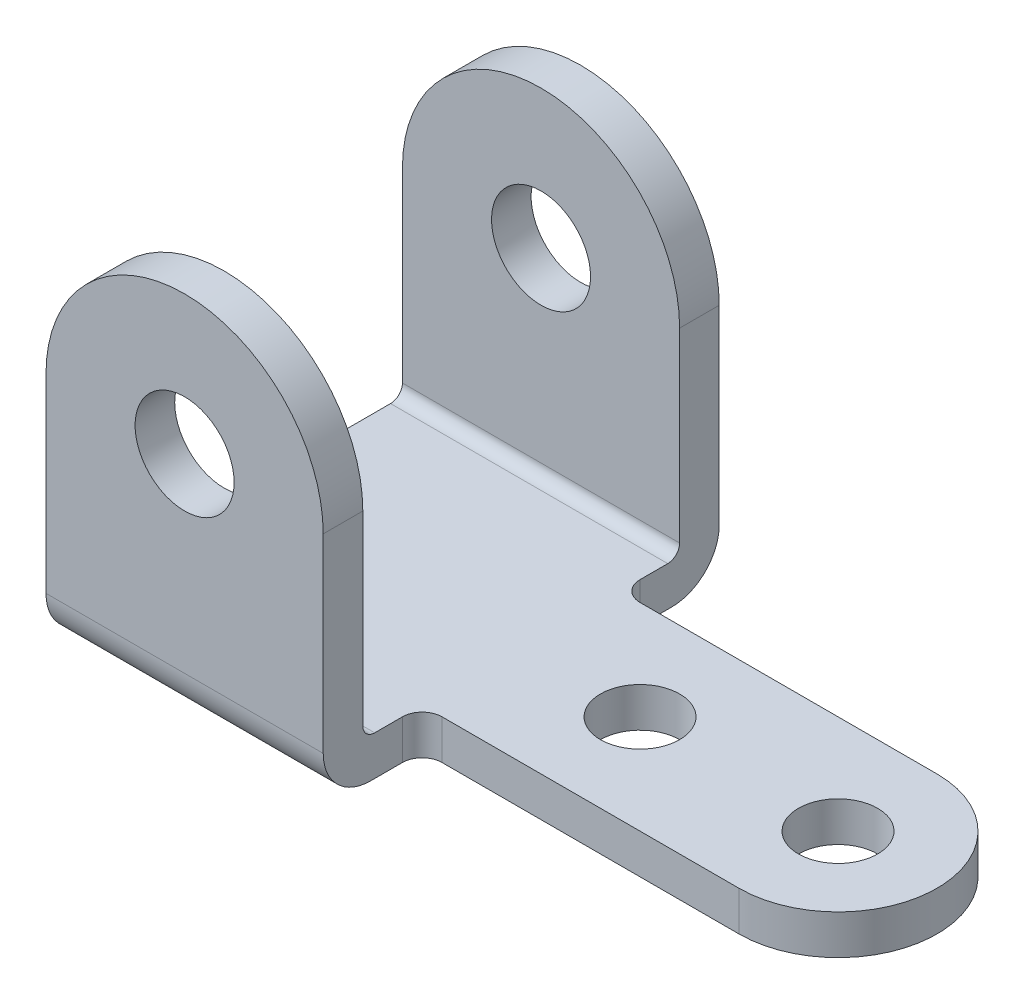
ISO-10303-21;
HEADER;
FILE_DESCRIPTION(('STEP AP214'),'2;1');
FILE_NAME('part.step','',(''),(''),'','','');
FILE_SCHEMA(('AUTOMOTIVE_DESIGN { 1 0 10303 214 1 1 1 1 }'));
ENDSEC;
DATA;
#1=APPLICATION_CONTEXT('core data for automotive mechanical design processes');
#2=APPLICATION_PROTOCOL_DEFINITION('international standard','automotive_design',2000,#1);
#3=PRODUCT_CONTEXT('',#1,'mechanical');
#4=PRODUCT('Part','Part','',(#3));
#5=PRODUCT_RELATED_PRODUCT_CATEGORY('part','',(#4));
#6=PRODUCT_DEFINITION_FORMATION('','',#4);
#7=PRODUCT_DEFINITION_CONTEXT('part definition',#1,'design');
#8=PRODUCT_DEFINITION('design','',#6,#7);
#9=PRODUCT_DEFINITION_SHAPE('','',#8);
#10=(LENGTH_UNIT() NAMED_UNIT(*) SI_UNIT(.MILLI.,.METRE.));
#11=(NAMED_UNIT(*) PLANE_ANGLE_UNIT() SI_UNIT($,.RADIAN.));
#12=(NAMED_UNIT(*) SI_UNIT($,.STERADIAN.) SOLID_ANGLE_UNIT());
#13=UNCERTAINTY_MEASURE_WITH_UNIT(LENGTH_MEASURE(1.E-05),#10,'distance_accuracy_value','');
#14=(GEOMETRIC_REPRESENTATION_CONTEXT(3) GLOBAL_UNCERTAINTY_ASSIGNED_CONTEXT((#13)) GLOBAL_UNIT_ASSIGNED_CONTEXT((#10,
#11,#12)) REPRESENTATION_CONTEXT('',''));
#15=CARTESIAN_POINT('',(0.,0.,0.));
#16=DIRECTION('',(0.,0.,1.));
#17=DIRECTION('',(1.,0.,0.));
#18=AXIS2_PLACEMENT_3D('',#15,#16,#17);
#19=CARTESIAN_POINT('',(70.,60.,10.));
#20=DIRECTION('',(1.,0.,0.));
#21=DIRECTION('',(0.,1.,0.));
#22=AXIS2_PLACEMENT_3D('',#19,#20,#21);
#23=PLANE('',#22);
#24=DIRECTION('',(0.,0.,-1.));
#25=VECTOR('',#24,1.);
#26=CARTESIAN_POINT('',(70.,0.,10.));
#27=LINE('',#26,#25);
#28=CARTESIAN_POINT('',(70.,0.,20.));
#29=VERTEX_POINT('',#28);
#30=CARTESIAN_POINT('',(70.,0.,12.));
#31=VERTEX_POINT('',#30);
#32=EDGE_CURVE('E246',#29,#31,#27,.T.);
#33=ORIENTED_EDGE('',*,*,#32,.T.);
#34=CARTESIAN_POINT('',(70.,12.,12.));
#35=DIRECTION('',(1.,0.,0.));
#36=DIRECTION('',(0.,1.,0.));
#37=AXIS2_PLACEMENT_3D('',#34,#35,#36);
#38=CIRCLE('',#37,12.);
#39=CARTESIAN_POINT('',(70.,12.,0.));
#40=VERTEX_POINT('',#39);
#41=EDGE_CURVE('E295',#31,#40,#38,.T.);
#42=ORIENTED_EDGE('',*,*,#41,.T.);
#43=DIRECTION('',(0.,-1.,0.));
#44=VECTOR('',#43,1.);
#45=CARTESIAN_POINT('',(70.,60.,0.));
#46=LINE('',#45,#44);
#47=CARTESIAN_POINT('',(70.,60.,0.));
#48=VERTEX_POINT('',#47);
#49=EDGE_CURVE('E236',#48,#40,#46,.T.);
#50=ORIENTED_EDGE('',*,*,#49,.F.);
#51=DIRECTION('',(0.,0.,-1.));
#52=VECTOR('',#51,1.);
#53=CARTESIAN_POINT('',(70.,60.,10.));
#54=LINE('',#53,#52);
#55=CARTESIAN_POINT('',(70.,60.,10.));
#56=VERTEX_POINT('',#55);
#57=EDGE_CURVE('E253',#56,#48,#54,.T.);
#58=ORIENTED_EDGE('',*,*,#57,.F.);
#59=DIRECTION('',(0.,-1.,0.));
#60=VECTOR('',#59,1.);
#61=CARTESIAN_POINT('',(70.,60.,10.));
#62=LINE('',#61,#60);
#63=CARTESIAN_POINT('',(70.,13.,10.));
#64=VERTEX_POINT('',#63);
#65=EDGE_CURVE('E237',#56,#64,#62,.T.);
#66=ORIENTED_EDGE('',*,*,#65,.T.);
#67=CARTESIAN_POINT('',(70.,13.,13.));
#68=DIRECTION('',(1.,0.,0.));
#69=DIRECTION('',(0.,1.,0.));
#70=AXIS2_PLACEMENT_3D('',#67,#68,#69);
#71=CIRCLE('',#70,3.);
#72=CARTESIAN_POINT('',(70.,10.,13.));
#73=VERTEX_POINT('',#72);
#74=EDGE_CURVE('E304',#64,#73,#71,.F.);
#75=ORIENTED_EDGE('',*,*,#74,.T.);
#76=DIRECTION('',(0.,0.,-1.));
#77=VECTOR('',#76,1.);
#78=CARTESIAN_POINT('',(70.,10.,90.));
#79=LINE('',#78,#77);
#80=CARTESIAN_POINT('',(70.,10.,20.));
#81=VERTEX_POINT('',#80);
#82=EDGE_CURVE('E233',#81,#73,#79,.T.);
#83=ORIENTED_EDGE('',*,*,#82,.F.);
#84=DIRECTION('',(0.,1.,0.));
#85=VECTOR('',#84,1.);
#86=CARTESIAN_POINT('',(70.,0.,20.));
#87=LINE('',#86,#85);
#88=EDGE_CURVE('E265',#81,#29,#87,.F.);
#89=ORIENTED_EDGE('',*,*,#88,.T.);
#90=EDGE_LOOP('',(#33,#42,#50,#58,#66,#75,#83,#89));
#91=FACE_BOUND('',#90,.T.);
#92=ADVANCED_FACE('F37',(#91),#23,.T.);
#93=CARTESIAN_POINT('',(35.,60.,10.));
#94=DIRECTION('',(0.,0.,-1.));
#95=DIRECTION('',(-1.,0.,0.));
#96=AXIS2_PLACEMENT_3D('',#93,#94,#95);
#97=PLANE('',#96);
#98=CARTESIAN_POINT('',(35.,60.,10.));
#99=DIRECTION('',(0.,0.,-1.));
#100=DIRECTION('',(-1.,0.,0.));
#101=AXIS2_PLACEMENT_3D('',#98,#99,#100);
#102=CIRCLE('',#101,12.5);
#103=CARTESIAN_POINT('',(22.5,60.,10.));
#104=VERTEX_POINT('',#103);
#105=EDGE_CURVE('E208',#104,#104,#102,.T.);
#106=ORIENTED_EDGE('',*,*,#105,.T.);
#107=EDGE_LOOP('',(#106));
#108=FACE_BOUND('',#107,.T.);
#109=DIRECTION('',(0.,1.,0.));
#110=VECTOR('',#109,1.);
#111=CARTESIAN_POINT('',(0.,0.,10.));
#112=LINE('',#111,#110);
#113=CARTESIAN_POINT('',(0.,13.,10.));
#114=VERTEX_POINT('',#113);
#115=CARTESIAN_POINT('',(0.,60.,10.));
#116=VERTEX_POINT('',#115);
#117=EDGE_CURVE('E240',#114,#116,#112,.T.);
#118=ORIENTED_EDGE('',*,*,#117,.F.);
#119=DIRECTION('',(-1.,0.,0.));
#120=VECTOR('',#119,1.);
#121=CARTESIAN_POINT('',(35.,13.,10.));
#122=LINE('',#121,#120);
#123=EDGE_CURVE('E300',#114,#64,#122,.F.);
#124=ORIENTED_EDGE('',*,*,#123,.T.);
#125=ORIENTED_EDGE('',*,*,#65,.F.);
#126=CARTESIAN_POINT('',(35.,60.,10.));
#127=DIRECTION('',(0.,0.,-1.));
#128=DIRECTION('',(-1.,0.,0.));
#129=AXIS2_PLACEMENT_3D('',#126,#127,#128);
#130=CIRCLE('',#129,35.);
#131=EDGE_CURVE('E243',#116,#56,#130,.T.);
#132=ORIENTED_EDGE('',*,*,#131,.F.);
#133=EDGE_LOOP('',(#118,#124,#125,#132));
#134=FACE_BOUND('',#133,.T.);
#135=ADVANCED_FACE('F351',(#108,#134),#97,.F.);
#136=DIRECTION('',(0.,1.,0.));
#137=VECTOR('',#136,1.);
#138=CARTESIAN_POINT('',(70.,60.,100.));
#139=LINE('',#138,#137);
#140=CARTESIAN_POINT('',(70.,12.,100.));
#141=VERTEX_POINT('',#140);
#142=CARTESIAN_POINT('',(70.,60.,100.));
#143=VERTEX_POINT('',#142);
#144=EDGE_CURVE('E212',#141,#143,#139,.T.);
#145=ORIENTED_EDGE('',*,*,#144,.F.);
#146=CARTESIAN_POINT('',(70.,12.,88.));
#147=DIRECTION('',(1.,0.,0.));
#148=DIRECTION('',(0.,1.,0.));
#149=AXIS2_PLACEMENT_3D('',#146,#147,#148);
#150=CIRCLE('',#149,12.);
#151=CARTESIAN_POINT('',(70.,0.,88.));
#152=VERTEX_POINT('',#151);
#153=EDGE_CURVE('E282',#141,#152,#150,.T.);
#154=ORIENTED_EDGE('',*,*,#153,.T.);
#155=CARTESIAN_POINT('',(70.,0.,80.));
#156=VERTEX_POINT('',#155);
#157=EDGE_CURVE('E261',#152,#156,#27,.T.);
#158=ORIENTED_EDGE('',*,*,#157,.T.);
#159=DIRECTION('',(0.,1.,0.));
#160=VECTOR('',#159,1.);
#161=CARTESIAN_POINT('',(70.,10.,80.));
#162=LINE('',#161,#160);
#163=CARTESIAN_POINT('',(70.,10.,80.));
#164=VERTEX_POINT('',#163);
#165=EDGE_CURVE('E267',#156,#164,#162,.T.);
#166=ORIENTED_EDGE('',*,*,#165,.T.);
#167=CARTESIAN_POINT('',(70.,10.,87.));
#168=VERTEX_POINT('',#167);
#169=EDGE_CURVE('E234',#168,#164,#79,.T.);
#170=ORIENTED_EDGE('',*,*,#169,.F.);
#171=CARTESIAN_POINT('',(70.,13.,87.));
#172=DIRECTION('',(1.,0.,0.));
#173=DIRECTION('',(0.,1.,0.));
#174=AXIS2_PLACEMENT_3D('',#171,#172,#173);
#175=CIRCLE('',#174,3.);
#176=CARTESIAN_POINT('',(70.,13.,90.));
#177=VERTEX_POINT('',#176);
#178=EDGE_CURVE('E45',#168,#177,#175,.F.);
#179=ORIENTED_EDGE('',*,*,#178,.T.);
#180=DIRECTION('',(0.,1.,0.));
#181=VECTOR('',#180,1.);
#182=CARTESIAN_POINT('',(70.,60.,90.));
#183=LINE('',#182,#181);
#184=CARTESIAN_POINT('',(70.,60.,90.));
#185=VERTEX_POINT('',#184);
#186=EDGE_CURVE('E211',#177,#185,#183,.T.);
#187=ORIENTED_EDGE('',*,*,#186,.T.);
#188=DIRECTION('',(0.,0.,-1.));
#189=VECTOR('',#188,1.);
#190=CARTESIAN_POINT('',(70.,60.,100.));
#191=LINE('',#190,#189);
#192=EDGE_CURVE('E227',#143,#185,#191,.T.);
#193=ORIENTED_EDGE('',*,*,#192,.F.);
#194=EDGE_LOOP('',(#145,#154,#158,#166,#170,#179,#187,#193));
#195=FACE_BOUND('',#194,.T.);
#196=ADVANCED_FACE('F317',(#195),#23,.T.);
#197=CARTESIAN_POINT('',(35.,60.,10.));
#198=DIRECTION('',(0.,0.,-1.));
#199=DIRECTION('',(-1.,0.,0.));
#200=AXIS2_PLACEMENT_3D('',#197,#198,#199);
#201=CYLINDRICAL_SURFACE('',#200,35.);
#202=CARTESIAN_POINT('',(35.,60.,0.));
#203=DIRECTION('',(0.,0.,-1.));
#204=DIRECTION('',(-1.,0.,0.));
#205=AXIS2_PLACEMENT_3D('',#202,#203,#204);
#206=CIRCLE('',#205,35.);
#207=CARTESIAN_POINT('',(0.,60.,0.));
#208=VERTEX_POINT('',#207);
#209=EDGE_CURVE('E241',#208,#48,#206,.T.);
#210=ORIENTED_EDGE('',*,*,#209,.F.);
#211=DIRECTION('',(0.,0.,-1.));
#212=VECTOR('',#211,1.);
#213=CARTESIAN_POINT('',(0.,60.,10.));
#214=LINE('',#213,#212);
#215=EDGE_CURVE('E256',#116,#208,#214,.T.);
#216=ORIENTED_EDGE('',*,*,#215,.F.);
#217=ORIENTED_EDGE('',*,*,#131,.T.);
#218=ORIENTED_EDGE('',*,*,#57,.T.);
#219=EDGE_LOOP('',(#210,#216,#217,#218));
#220=FACE_BOUND('',#219,.T.);
#221=ADVANCED_FACE('F361',(#220),#201,.T.);
#222=CARTESIAN_POINT('',(0.,0.,10.));
#223=DIRECTION('',(-1.,0.,0.));
#224=DIRECTION('',(0.,0.,1.));
#225=AXIS2_PLACEMENT_3D('',#222,#223,#224);
#226=PLANE('',#225);
#227=DIRECTION('',(0.,1.,0.));
#228=VECTOR('',#227,1.);
#229=CARTESIAN_POINT('',(0.,0.,0.));
#230=LINE('',#229,#228);
#231=CARTESIAN_POINT('',(0.,12.,0.));
#232=VERTEX_POINT('',#231);
#233=EDGE_CURVE('E249',#232,#208,#230,.T.);
#234=ORIENTED_EDGE('',*,*,#233,.F.);
#235=CARTESIAN_POINT('',(0.,12.,12.));
#236=DIRECTION('',(-1.,0.,0.));
#237=DIRECTION('',(0.,0.,1.));
#238=AXIS2_PLACEMENT_3D('',#235,#236,#237);
#239=CIRCLE('',#238,12.);
#240=CARTESIAN_POINT('',(0.,0.,12.));
#241=VERTEX_POINT('',#240);
#242=EDGE_CURVE('E291',#232,#241,#239,.T.);
#243=ORIENTED_EDGE('',*,*,#242,.T.);
#244=DIRECTION('',(0.,0.,-1.));
#245=VECTOR('',#244,1.);
#246=CARTESIAN_POINT('',(0.,0.,10.));
#247=LINE('',#246,#245);
#248=CARTESIAN_POINT('',(0.,0.,88.));
#249=VERTEX_POINT('',#248);
#250=EDGE_CURVE('E259',#249,#241,#247,.T.);
#251=ORIENTED_EDGE('',*,*,#250,.F.);
#252=CARTESIAN_POINT('',(0.,12.,88.));
#253=DIRECTION('',(-1.,0.,0.));
#254=DIRECTION('',(0.,0.,1.));
#255=AXIS2_PLACEMENT_3D('',#252,#253,#254);
#256=CIRCLE('',#255,12.);
#257=CARTESIAN_POINT('',(0.,12.,100.));
#258=VERTEX_POINT('',#257);
#259=EDGE_CURVE('E286',#249,#258,#256,.T.);
#260=ORIENTED_EDGE('',*,*,#259,.T.);
#261=DIRECTION('',(0.,-1.,0.));
#262=VECTOR('',#261,1.);
#263=CARTESIAN_POINT('',(0.,0.,100.));
#264=LINE('',#263,#262);
#265=CARTESIAN_POINT('',(0.,60.,100.));
#266=VERTEX_POINT('',#265);
#267=EDGE_CURVE('E217',#266,#258,#264,.T.);
#268=ORIENTED_EDGE('',*,*,#267,.F.);
#269=DIRECTION('',(0.,0.,-1.));
#270=VECTOR('',#269,1.);
#271=CARTESIAN_POINT('',(0.,60.,100.));
#272=LINE('',#271,#270);
#273=CARTESIAN_POINT('',(0.,60.,90.));
#274=VERTEX_POINT('',#273);
#275=EDGE_CURVE('E220',#266,#274,#272,.T.);
#276=ORIENTED_EDGE('',*,*,#275,.T.);
#277=DIRECTION('',(0.,-1.,0.));
#278=VECTOR('',#277,1.);
#279=CARTESIAN_POINT('',(0.,0.,90.));
#280=LINE('',#279,#278);
#281=CARTESIAN_POINT('',(0.,13.,90.));
#282=VERTEX_POINT('',#281);
#283=EDGE_CURVE('E215',#274,#282,#280,.T.);
#284=ORIENTED_EDGE('',*,*,#283,.T.);
#285=CARTESIAN_POINT('',(0.,13.,87.));
#286=DIRECTION('',(-1.,0.,0.));
#287=DIRECTION('',(0.,0.,1.));
#288=AXIS2_PLACEMENT_3D('',#285,#286,#287);
#289=CIRCLE('',#288,3.);
#290=CARTESIAN_POINT('',(0.,10.,87.));
#291=VERTEX_POINT('',#290);
#292=EDGE_CURVE('E11',#282,#291,#289,.F.);
#293=ORIENTED_EDGE('',*,*,#292,.T.);
#294=DIRECTION('',(0.,0.,1.));
#295=VECTOR('',#294,1.);
#296=CARTESIAN_POINT('',(0.,10.,10.));
#297=LINE('',#296,#295);
#298=CARTESIAN_POINT('',(0.,10.,13.));
#299=VERTEX_POINT('',#298);
#300=EDGE_CURVE('E230',#299,#291,#297,.T.);
#301=ORIENTED_EDGE('',*,*,#300,.F.);
#302=CARTESIAN_POINT('',(0.,13.,13.));
#303=DIRECTION('',(-1.,0.,0.));
#304=DIRECTION('',(0.,0.,1.));
#305=AXIS2_PLACEMENT_3D('',#302,#303,#304);
#306=CIRCLE('',#305,3.);
#307=EDGE_CURVE('E302',#299,#114,#306,.F.);
#308=ORIENTED_EDGE('',*,*,#307,.T.);
#309=ORIENTED_EDGE('',*,*,#117,.T.);
#310=ORIENTED_EDGE('',*,*,#215,.T.);
#311=EDGE_LOOP('',(#234,#243,#251,#260,#268,#276,#284,#293,#301,#308,#309,#310));
#312=FACE_BOUND('',#311,.T.);
#313=ADVANCED_FACE('F343',(#312),#226,.T.);
#314=CARTESIAN_POINT('',(70.,0.,10.));
#315=DIRECTION('',(0.,-1.,0.));
#316=DIRECTION('',(1.,0.,0.));
#317=AXIS2_PLACEMENT_3D('',#314,#315,#316);
#318=PLANE('',#317);
#319=CARTESIAN_POINT('',(150.,0.,50.));
#320=DIRECTION('',(0.,1.,0.));
#321=DIRECTION('',(-1.,0.,0.));
#322=AXIS2_PLACEMENT_3D('',#319,#320,#321);
#323=CIRCLE('',#322,10.);
#324=CARTESIAN_POINT('',(140.,0.,50.));
#325=VERTEX_POINT('',#324);
#326=EDGE_CURVE('E194',#325,#325,#323,.T.);
#327=ORIENTED_EDGE('',*,*,#326,.T.);
#328=EDGE_LOOP('',(#327));
#329=FACE_BOUND('',#328,.T.);
#330=CARTESIAN_POINT('',(100.,0.,50.));
#331=DIRECTION('',(0.,1.,0.));
#332=DIRECTION('',(-1.,0.,0.));
#333=AXIS2_PLACEMENT_3D('',#330,#331,#332);
#334=CIRCLE('',#333,9.99999999999999);
#335=CARTESIAN_POINT('',(90.,0.,50.));
#336=VERTEX_POINT('',#335);
#337=EDGE_CURVE('E385',#336,#336,#334,.T.);
#338=ORIENTED_EDGE('',*,*,#337,.T.);
#339=EDGE_LOOP('',(#338));
#340=FACE_BOUND('',#339,.T.);
#341=ORIENTED_EDGE('',*,*,#250,.T.);
#342=DIRECTION('',(-1.,0.,0.));
#343=VECTOR('',#342,1.);
#344=CARTESIAN_POINT('',(70.,0.,12.));
#345=LINE('',#344,#343);
#346=EDGE_CURVE('E293',#241,#31,#345,.F.);
#347=ORIENTED_EDGE('',*,*,#346,.T.);
#348=ORIENTED_EDGE('',*,*,#32,.F.);
#349=CARTESIAN_POINT('',(75.,0.,20.));
#350=DIRECTION('',(0.,-1.,0.));
#351=DIRECTION('',(1.,0.,0.));
#352=AXIS2_PLACEMENT_3D('',#349,#350,#351);
#353=CIRCLE('',#352,5.);
#354=CARTESIAN_POINT('',(75.,0.,25.));
#355=VERTEX_POINT('',#354);
#356=EDGE_CURVE('E273',#29,#355,#353,.F.);
#357=ORIENTED_EDGE('',*,*,#356,.T.);
#358=DIRECTION('',(-1.,0.,0.));
#359=VECTOR('',#358,1.);
#360=CARTESIAN_POINT('',(70.,0.,25.));
#361=LINE('',#360,#359);
#362=CARTESIAN_POINT('',(150.,0.,25.));
#363=VERTEX_POINT('',#362);
#364=EDGE_CURVE('E183',#363,#355,#361,.T.);
#365=ORIENTED_EDGE('',*,*,#364,.F.);
#366=CARTESIAN_POINT('',(150.,0.,50.));
#367=DIRECTION('',(0.,1.,0.));
#368=DIRECTION('',(1.,0.,0.));
#369=AXIS2_PLACEMENT_3D('',#366,#367,#368);
#370=CIRCLE('',#369,25.);
#371=CARTESIAN_POINT('',(150.,0.,75.));
#372=VERTEX_POINT('',#371);
#373=EDGE_CURVE('E173',#372,#363,#370,.T.);
#374=ORIENTED_EDGE('',*,*,#373,.F.);
#375=DIRECTION('',(1.,0.,0.));
#376=VECTOR('',#375,1.);
#377=CARTESIAN_POINT('',(150.,0.,75.));
#378=LINE('',#377,#376);
#379=CARTESIAN_POINT('',(75.,0.,75.));
#380=VERTEX_POINT('',#379);
#381=EDGE_CURVE('E161',#380,#372,#378,.T.);
#382=ORIENTED_EDGE('',*,*,#381,.F.);
#383=CARTESIAN_POINT('',(75.,0.,80.));
#384=DIRECTION('',(0.,-1.,0.));
#385=DIRECTION('',(1.,0.,0.));
#386=AXIS2_PLACEMENT_3D('',#383,#384,#385);
#387=CIRCLE('',#386,5.);
#388=EDGE_CURVE('E277',#380,#156,#387,.F.);
#389=ORIENTED_EDGE('',*,*,#388,.T.);
#390=ORIENTED_EDGE('',*,*,#157,.F.);
#391=DIRECTION('',(1.,0.,0.));
#392=VECTOR('',#391,1.);
#393=CARTESIAN_POINT('',(0.,0.,88.));
#394=LINE('',#393,#392);
#395=EDGE_CURVE('E284',#152,#249,#394,.F.);
#396=ORIENTED_EDGE('',*,*,#395,.T.);
#397=EDGE_LOOP('',(#341,#347,#348,#357,#365,#374,#382,#389,#390,#396));
#398=FACE_BOUND('',#397,.T.);
#399=ADVANCED_FACE('F186',(#329,#340,#398),#318,.T.);
#400=CARTESIAN_POINT('',(35.,60.,0.));
#401=DIRECTION('',(0.,0.,-1.));
#402=DIRECTION('',(-1.,0.,0.));
#403=AXIS2_PLACEMENT_3D('',#400,#401,#402);
#404=PLANE('',#403);
#405=CARTESIAN_POINT('',(35.,60.,0.));
#406=DIRECTION('',(0.,0.,1.));
#407=DIRECTION('',(1.,0.,0.));
#408=AXIS2_PLACEMENT_3D('',#405,#406,#407);
#409=CIRCLE('',#408,12.5);
#410=CARTESIAN_POINT('',(47.5,60.,0.));
#411=VERTEX_POINT('',#410);
#412=EDGE_CURVE('E200',#411,#411,#409,.T.);
#413=ORIENTED_EDGE('',*,*,#412,.T.);
#414=EDGE_LOOP('',(#413));
#415=FACE_BOUND('',#414,.T.);
#416=ORIENTED_EDGE('',*,*,#49,.T.);
#417=DIRECTION('',(-1.,0.,0.));
#418=VECTOR('',#417,1.);
#419=CARTESIAN_POINT('',(35.,12.,0.));
#420=LINE('',#419,#418);
#421=EDGE_CURVE('E288',#40,#232,#420,.T.);
#422=ORIENTED_EDGE('',*,*,#421,.T.);
#423=ORIENTED_EDGE('',*,*,#233,.T.);
#424=ORIENTED_EDGE('',*,*,#209,.T.);
#425=EDGE_LOOP('',(#416,#422,#423,#424));
#426=FACE_BOUND('',#425,.T.);
#427=ADVANCED_FACE('F373',(#415,#426),#404,.T.);
#428=CARTESIAN_POINT('',(0.,10.,0.));
#429=DIRECTION('',(0.,1.,0.));
#430=DIRECTION('',(-1.,0.,0.));
#431=AXIS2_PLACEMENT_3D('',#428,#429,#430);
#432=PLANE('',#431);
#433=CARTESIAN_POINT('',(150.,10.,50.));
#434=DIRECTION('',(0.,1.,0.));
#435=DIRECTION('',(-1.,0.,0.));
#436=AXIS2_PLACEMENT_3D('',#433,#434,#435);
#437=CIRCLE('',#436,10.);
#438=CARTESIAN_POINT('',(140.,10.,50.));
#439=VERTEX_POINT('',#438);
#440=EDGE_CURVE('E387',#439,#439,#437,.T.);
#441=ORIENTED_EDGE('',*,*,#440,.F.);
#442=EDGE_LOOP('',(#441));
#443=FACE_BOUND('',#442,.T.);
#444=CARTESIAN_POINT('',(100.,10.,50.));
#445=DIRECTION('',(0.,1.,0.));
#446=DIRECTION('',(-1.,0.,0.));
#447=AXIS2_PLACEMENT_3D('',#444,#445,#446);
#448=CIRCLE('',#447,9.99999999999999);
#449=CARTESIAN_POINT('',(90.,10.,50.));
#450=VERTEX_POINT('',#449);
#451=EDGE_CURVE('E388',#450,#450,#448,.T.);
#452=ORIENTED_EDGE('',*,*,#451,.F.);
#453=EDGE_LOOP('',(#452));
#454=FACE_BOUND('',#453,.T.);
#455=ORIENTED_EDGE('',*,*,#300,.T.);
#456=DIRECTION('',(1.,0.,0.));
#457=VECTOR('',#456,1.);
#458=CARTESIAN_POINT('',(70.,10.,87.));
#459=LINE('',#458,#457);
#460=EDGE_CURVE('E306',#291,#168,#459,.T.);
#461=ORIENTED_EDGE('',*,*,#460,.T.);
#462=ORIENTED_EDGE('',*,*,#169,.T.);
#463=CARTESIAN_POINT('',(75.,10.,80.));
#464=DIRECTION('',(0.,1.,0.));
#465=DIRECTION('',(-1.,0.,0.));
#466=AXIS2_PLACEMENT_3D('',#463,#464,#465);
#467=CIRCLE('',#466,5.);
#468=CARTESIAN_POINT('',(75.,10.,75.));
#469=VERTEX_POINT('',#468);
#470=EDGE_CURVE('E275',#164,#469,#467,.F.);
#471=ORIENTED_EDGE('',*,*,#470,.T.);
#472=DIRECTION('',(1.,0.,0.));
#473=VECTOR('',#472,1.);
#474=CARTESIAN_POINT('',(150.,10.,75.));
#475=LINE('',#474,#473);
#476=CARTESIAN_POINT('',(150.,10.,75.));
#477=VERTEX_POINT('',#476);
#478=EDGE_CURVE('E192',#469,#477,#475,.T.);
#479=ORIENTED_EDGE('',*,*,#478,.T.);
#480=CARTESIAN_POINT('',(150.,10.,50.));
#481=DIRECTION('',(0.,1.,0.));
#482=DIRECTION('',(1.,0.,0.));
#483=AXIS2_PLACEMENT_3D('',#480,#481,#482);
#484=CIRCLE('',#483,25.);
#485=CARTESIAN_POINT('',(150.,10.,25.));
#486=VERTEX_POINT('',#485);
#487=EDGE_CURVE('E181',#477,#486,#484,.T.);
#488=ORIENTED_EDGE('',*,*,#487,.T.);
#489=DIRECTION('',(-1.,0.,0.));
#490=VECTOR('',#489,1.);
#491=CARTESIAN_POINT('',(70.,10.,25.));
#492=LINE('',#491,#490);
#493=CARTESIAN_POINT('',(75.,10.,25.));
#494=VERTEX_POINT('',#493);
#495=EDGE_CURVE('E174',#486,#494,#492,.T.);
#496=ORIENTED_EDGE('',*,*,#495,.T.);
#497=CARTESIAN_POINT('',(75.,10.,20.));
#498=DIRECTION('',(0.,1.,0.));
#499=DIRECTION('',(-1.,0.,0.));
#500=AXIS2_PLACEMENT_3D('',#497,#498,#499);
#501=CIRCLE('',#500,5.);
#502=EDGE_CURVE('E271',#494,#81,#501,.F.);
#503=ORIENTED_EDGE('',*,*,#502,.T.);
#504=ORIENTED_EDGE('',*,*,#82,.T.);
#505=DIRECTION('',(-1.,0.,0.));
#506=VECTOR('',#505,1.);
#507=CARTESIAN_POINT('',(0.,10.,13.));
#508=LINE('',#507,#506);
#509=EDGE_CURVE('E297',#73,#299,#508,.T.);
#510=ORIENTED_EDGE('',*,*,#509,.T.);
#511=EDGE_LOOP('',(#455,#461,#462,#471,#479,#488,#496,#503,#504,#510));
#512=FACE_BOUND('',#511,.T.);
#513=ADVANCED_FACE('F311',(#443,#454,#512),#432,.T.);
#514=CARTESIAN_POINT('',(35.,60.,90.));
#515=DIRECTION('',(0.,0.,-1.));
#516=DIRECTION('',(-1.,0.,0.));
#517=AXIS2_PLACEMENT_3D('',#514,#515,#516);
#518=PLANE('',#517);
#519=CARTESIAN_POINT('',(35.,60.,90.));
#520=DIRECTION('',(0.,0.,-1.));
#521=DIRECTION('',(-1.,0.,0.));
#522=AXIS2_PLACEMENT_3D('',#519,#520,#521);
#523=CIRCLE('',#522,12.5);
#524=CARTESIAN_POINT('',(22.5,60.,90.));
#525=VERTEX_POINT('',#524);
#526=EDGE_CURVE('E203',#525,#525,#523,.T.);
#527=ORIENTED_EDGE('',*,*,#526,.F.);
#528=EDGE_LOOP('',(#527));
#529=FACE_BOUND('',#528,.T.);
#530=ORIENTED_EDGE('',*,*,#186,.F.);
#531=DIRECTION('',(1.,0.,0.));
#532=VECTOR('',#531,1.);
#533=CARTESIAN_POINT('',(0.,13.,90.));
#534=LINE('',#533,#532);
#535=EDGE_CURVE('E58',#177,#282,#534,.F.);
#536=ORIENTED_EDGE('',*,*,#535,.T.);
#537=ORIENTED_EDGE('',*,*,#283,.F.);
#538=CARTESIAN_POINT('',(35.,60.,90.));
#539=DIRECTION('',(0.,0.,1.));
#540=DIRECTION('',(-1.,0.,0.));
#541=AXIS2_PLACEMENT_3D('',#538,#539,#540);
#542=CIRCLE('',#541,35.);
#543=EDGE_CURVE('E222',#185,#274,#542,.T.);
#544=ORIENTED_EDGE('',*,*,#543,.F.);
#545=EDGE_LOOP('',(#530,#536,#537,#544));
#546=FACE_BOUND('',#545,.T.);
#547=ADVANCED_FACE('F399',(#529,#546),#518,.T.);
#548=CARTESIAN_POINT('',(35.,60.,100.));
#549=DIRECTION('',(0.,0.,-1.));
#550=DIRECTION('',(-1.,0.,0.));
#551=AXIS2_PLACEMENT_3D('',#548,#549,#550);
#552=CYLINDRICAL_SURFACE('',#551,35.);
#553=ORIENTED_EDGE('',*,*,#543,.T.);
#554=ORIENTED_EDGE('',*,*,#275,.F.);
#555=CARTESIAN_POINT('',(35.,60.,100.));
#556=DIRECTION('',(0.,0.,1.));
#557=DIRECTION('',(-1.,0.,0.));
#558=AXIS2_PLACEMENT_3D('',#555,#556,#557);
#559=CIRCLE('',#558,35.);
#560=EDGE_CURVE('E214',#143,#266,#559,.T.);
#561=ORIENTED_EDGE('',*,*,#560,.F.);
#562=ORIENTED_EDGE('',*,*,#192,.T.);
#563=EDGE_LOOP('',(#553,#554,#561,#562));
#564=FACE_BOUND('',#563,.T.);
#565=ADVANCED_FACE('F405',(#564),#552,.T.);
#566=CARTESIAN_POINT('',(35.,60.,100.));
#567=DIRECTION('',(0.,0.,-1.));
#568=DIRECTION('',(-1.,0.,0.));
#569=AXIS2_PLACEMENT_3D('',#566,#567,#568);
#570=PLANE('',#569);
#571=CARTESIAN_POINT('',(35.,60.,100.));
#572=DIRECTION('',(0.,0.,1.));
#573=DIRECTION('',(1.,0.,0.));
#574=AXIS2_PLACEMENT_3D('',#571,#572,#573);
#575=CIRCLE('',#574,12.5);
#576=CARTESIAN_POINT('',(47.5,60.,100.));
#577=VERTEX_POINT('',#576);
#578=EDGE_CURVE('E198',#577,#577,#575,.T.);
#579=ORIENTED_EDGE('',*,*,#578,.F.);
#580=EDGE_LOOP('',(#579));
#581=FACE_BOUND('',#580,.T.);
#582=ORIENTED_EDGE('',*,*,#267,.T.);
#583=DIRECTION('',(1.,0.,0.));
#584=VECTOR('',#583,1.);
#585=CARTESIAN_POINT('',(70.,12.,100.));
#586=LINE('',#585,#584);
#587=EDGE_CURVE('E279',#258,#141,#586,.T.);
#588=ORIENTED_EDGE('',*,*,#587,.T.);
#589=ORIENTED_EDGE('',*,*,#144,.T.);
#590=ORIENTED_EDGE('',*,*,#560,.T.);
#591=EDGE_LOOP('',(#582,#588,#589,#590));
#592=FACE_BOUND('',#591,.T.);
#593=ADVANCED_FACE('F411',(#581,#592),#570,.F.);
#594=CARTESIAN_POINT('',(35.,60.,0.));
#595=DIRECTION('',(0.,0.,1.));
#596=DIRECTION('',(1.,0.,0.));
#597=AXIS2_PLACEMENT_3D('',#594,#595,#596);
#598=CYLINDRICAL_SURFACE('',#597,12.5);
#599=ORIENTED_EDGE('',*,*,#526,.T.);
#600=EDGE_LOOP('',(#599));
#601=FACE_BOUND('',#600,.T.);
#602=ORIENTED_EDGE('',*,*,#578,.T.);
#603=EDGE_LOOP('',(#602));
#604=FACE_BOUND('',#603,.T.);
#605=ADVANCED_FACE('F416',(#601,#604),#598,.F.);
#606=ORIENTED_EDGE('',*,*,#412,.F.);
#607=EDGE_LOOP('',(#606));
#608=FACE_BOUND('',#607,.T.);
#609=ORIENTED_EDGE('',*,*,#105,.F.);
#610=EDGE_LOOP('',(#609));
#611=FACE_BOUND('',#610,.T.);
#612=ADVANCED_FACE('F420',(#608,#611),#598,.F.);
#613=CARTESIAN_POINT('',(70.,0.,25.));
#614=DIRECTION('',(0.,0.,-1.));
#615=DIRECTION('',(-1.,0.,0.));
#616=AXIS2_PLACEMENT_3D('',#613,#614,#615);
#617=PLANE('',#616);
#618=ORIENTED_EDGE('',*,*,#364,.T.);
#619=DIRECTION('',(0.,1.,0.));
#620=VECTOR('',#619,1.);
#621=CARTESIAN_POINT('',(75.,10.,25.));
#622=LINE('',#621,#620);
#623=EDGE_CURVE('E255',#355,#494,#622,.T.);
#624=ORIENTED_EDGE('',*,*,#623,.T.);
#625=ORIENTED_EDGE('',*,*,#495,.F.);
#626=DIRECTION('',(0.,1.,0.));
#627=VECTOR('',#626,1.);
#628=CARTESIAN_POINT('',(150.,0.,25.));
#629=LINE('',#628,#627);
#630=EDGE_CURVE('E182',#363,#486,#629,.T.);
#631=ORIENTED_EDGE('',*,*,#630,.F.);
#632=EDGE_LOOP('',(#618,#624,#625,#631));
#633=FACE_BOUND('',#632,.T.);
#634=ADVANCED_FACE('F324',(#633),#617,.T.);
#635=CARTESIAN_POINT('',(150.,0.,50.));
#636=DIRECTION('',(0.,1.,0.));
#637=DIRECTION('',(-1.,0.,0.));
#638=AXIS2_PLACEMENT_3D('',#635,#636,#637);
#639=CYLINDRICAL_SURFACE('',#638,25.);
#640=ORIENTED_EDGE('',*,*,#487,.F.);
#641=DIRECTION('',(0.,1.,0.));
#642=VECTOR('',#641,1.);
#643=CARTESIAN_POINT('',(150.,0.,75.));
#644=LINE('',#643,#642);
#645=EDGE_CURVE('E165',#372,#477,#644,.T.);
#646=ORIENTED_EDGE('',*,*,#645,.F.);
#647=ORIENTED_EDGE('',*,*,#373,.T.);
#648=ORIENTED_EDGE('',*,*,#630,.T.);
#649=EDGE_LOOP('',(#640,#646,#647,#648));
#650=FACE_BOUND('',#649,.T.);
#651=ADVANCED_FACE('F178',(#650),#639,.T.);
#652=CARTESIAN_POINT('',(150.,0.,75.));
#653=DIRECTION('',(0.,0.,1.));
#654=DIRECTION('',(1.,0.,0.));
#655=AXIS2_PLACEMENT_3D('',#652,#653,#654);
#656=PLANE('',#655);
#657=ORIENTED_EDGE('',*,*,#478,.F.);
#658=DIRECTION('',(0.,1.,0.));
#659=VECTOR('',#658,1.);
#660=CARTESIAN_POINT('',(75.,0.,75.));
#661=LINE('',#660,#659);
#662=EDGE_CURVE('E168',#469,#380,#661,.F.);
#663=ORIENTED_EDGE('',*,*,#662,.T.);
#664=ORIENTED_EDGE('',*,*,#381,.T.);
#665=ORIENTED_EDGE('',*,*,#645,.T.);
#666=EDGE_LOOP('',(#657,#663,#664,#665));
#667=FACE_BOUND('',#666,.T.);
#668=ADVANCED_FACE('F164',(#667),#656,.T.);
#669=CARTESIAN_POINT('',(100.,0.,50.));
#670=DIRECTION('',(0.,1.,0.));
#671=DIRECTION('',(-1.,0.,0.));
#672=AXIS2_PLACEMENT_3D('',#669,#670,#671);
#673=CYLINDRICAL_SURFACE('',#672,9.99999999999999);
#674=CARTESIAN_POINT('',(90.,0.,50.));
#675=CARTESIAN_POINT('',(90.,0.104166666666659,50.));
#676=CARTESIAN_POINT('',(90.,0.208333333333326,50.));
#677=CARTESIAN_POINT('',(90.,0.416666666666659,50.));
#678=CARTESIAN_POINT('',(90.,0.520833333333326,50.));
#679=CARTESIAN_POINT('',(90.,0.72916666666666,50.));
#680=CARTESIAN_POINT('',(90.,0.833333333333327,50.));
#681=CARTESIAN_POINT('',(90.,1.04166666666666,50.));
#682=CARTESIAN_POINT('',(90.,1.14583333333333,50.));
#683=CARTESIAN_POINT('',(90.,1.35416666666666,50.));
#684=CARTESIAN_POINT('',(90.,1.45833333333333,50.));
#685=CARTESIAN_POINT('',(90.,1.66666666666666,50.));
#686=CARTESIAN_POINT('',(90.,1.77083333333333,50.));
#687=CARTESIAN_POINT('',(90.,1.97916666666666,50.));
#688=CARTESIAN_POINT('',(90.,2.08333333333333,50.));
#689=CARTESIAN_POINT('',(90.,2.29166666666666,50.));
#690=CARTESIAN_POINT('',(90.,2.39583333333333,50.));
#691=CARTESIAN_POINT('',(90.,2.60416666666666,50.));
#692=CARTESIAN_POINT('',(90.,2.70833333333333,50.));
#693=CARTESIAN_POINT('',(90.,2.91666666666666,50.));
#694=CARTESIAN_POINT('',(90.,3.02083333333333,50.));
#695=CARTESIAN_POINT('',(90.,3.22916666666667,50.));
#696=CARTESIAN_POINT('',(90.,3.33333333333333,50.));
#697=CARTESIAN_POINT('',(90.,3.54166666666667,50.));
#698=CARTESIAN_POINT('',(90.,3.64583333333333,50.));
#699=CARTESIAN_POINT('',(90.,3.85416666666667,50.));
#700=CARTESIAN_POINT('',(90.,3.95833333333333,50.));
#701=CARTESIAN_POINT('',(90.,4.16666666666667,50.));
#702=CARTESIAN_POINT('',(90.,4.27083333333333,50.));
#703=CARTESIAN_POINT('',(90.,4.47916666666667,50.));
#704=CARTESIAN_POINT('',(90.,4.58333333333333,50.));
#705=CARTESIAN_POINT('',(90.,4.79166666666667,50.));
#706=CARTESIAN_POINT('',(90.,4.89583333333334,50.));
#707=CARTESIAN_POINT('',(90.,5.10416666666667,50.));
#708=CARTESIAN_POINT('',(90.,5.20833333333334,50.));
#709=CARTESIAN_POINT('',(90.,5.41666666666667,50.));
#710=CARTESIAN_POINT('',(90.,5.52083333333334,50.));
#711=CARTESIAN_POINT('',(90.,5.72916666666667,50.));
#712=CARTESIAN_POINT('',(90.,5.83333333333334,50.));
#713=CARTESIAN_POINT('',(90.,6.04166666666667,50.));
#714=CARTESIAN_POINT('',(90.,6.14583333333334,50.));
#715=CARTESIAN_POINT('',(90.,6.35416666666667,50.));
#716=CARTESIAN_POINT('',(90.,6.45833333333334,50.));
#717=CARTESIAN_POINT('',(90.,6.66666666666667,50.));
#718=CARTESIAN_POINT('',(90.,6.77083333333334,50.));
#719=CARTESIAN_POINT('',(90.,6.97916666666667,50.));
#720=CARTESIAN_POINT('',(90.,7.08333333333334,50.));
#721=CARTESIAN_POINT('',(90.,7.29166666666667,50.));
#722=CARTESIAN_POINT('',(90.,7.39583333333334,50.));
#723=CARTESIAN_POINT('',(90.,7.60416666666667,50.));
#724=CARTESIAN_POINT('',(90.,7.70833333333334,50.));
#725=CARTESIAN_POINT('',(90.,7.91666666666667,50.));
#726=CARTESIAN_POINT('',(90.,8.02083333333334,50.));
#727=CARTESIAN_POINT('',(90.,8.22916666666667,50.));
#728=CARTESIAN_POINT('',(90.,8.33333333333334,50.));
#729=CARTESIAN_POINT('',(90.,8.54166666666668,50.));
#730=CARTESIAN_POINT('',(90.,8.64583333333334,50.));
#731=CARTESIAN_POINT('',(90.,8.85416666666668,50.));
#732=CARTESIAN_POINT('',(90.,8.95833333333334,50.));
#733=CARTESIAN_POINT('',(90.,9.16666666666668,50.));
#734=CARTESIAN_POINT('',(90.,9.27083333333334,50.));
#735=CARTESIAN_POINT('',(90.,9.47916666666668,50.));
#736=CARTESIAN_POINT('',(90.,9.58333333333334,50.));
#737=CARTESIAN_POINT('',(90.,9.79166666666668,50.));
#738=CARTESIAN_POINT('',(90.,9.89583333333334,50.));
#739=CARTESIAN_POINT('',(90.,10.,50.));
#740=B_SPLINE_CURVE_WITH_KNOTS('',3,(#674,#675,#676,#677,#678,#679,#680,#681,#682,#683,#684,
#685,#686,#687,#688,#689,#690,#691,#692,#693,#694,#695,#696,#697,#698,#699,#700,#701,#702,#703,
#704,#705,#706,#707,#708,#709,#710,#711,#712,#713,#714,#715,#716,#717,#718,#719,#720,#721,#722,
#723,#724,#725,#726,#727,#728,#729,#730,#731,#732,#733,#734,#735,#736,#737,#738,#739),
.UNSPECIFIED.,.F.,.F.,(4,2,2,2,2,2,2,2,2,2,2,2,2,2,2,2,2,2,2,2,2,2,2,2,2,2,2,2,2,2,2,2,4),(0.,
0.312500000000001,0.625000000000001,0.937500000000002,1.25,1.5625,1.875,2.1875,2.50000000000001,
2.81250000000001,3.12500000000001,3.43750000000001,3.75000000000001,4.06250000000001,
4.37500000000001,4.68750000000001,5.00000000000001,5.31250000000001,5.62500000000001,
5.93750000000001,6.25000000000001,6.56250000000001,6.87500000000002,7.18750000000002,
7.50000000000002,7.81250000000002,8.12500000000002,8.43750000000002,8.75000000000002,
9.06250000000002,9.37500000000002,9.68750000000002,10.),.UNSPECIFIED.);
#741=EDGE_CURVE('BSEAM396',#336,#450,#740,.T.);
#742=ORIENTED_EDGE('',*,*,#337,.F.);
#743=ORIENTED_EDGE('',*,*,#451,.T.);
#744=ORIENTED_EDGE('',*,*,#741,.T.);
#745=ORIENTED_EDGE('',*,*,#741,.F.);
#746=EDGE_LOOP('',(#742,#744,#743,#745));
#747=FACE_BOUND('',#746,.T.);
#748=ADVANCED_FACE('F396',(#747),#673,.F.);
#749=CARTESIAN_POINT('',(150.,0.,50.));
#750=DIRECTION('',(0.,1.,0.));
#751=DIRECTION('',(-1.,0.,0.));
#752=AXIS2_PLACEMENT_3D('',#749,#750,#751);
#753=CYLINDRICAL_SURFACE('',#752,10.);
#754=CARTESIAN_POINT('',(140.,0.,50.));
#755=CARTESIAN_POINT('',(140.,0.104166666666664,50.));
#756=CARTESIAN_POINT('',(140.,0.208333333333331,50.));
#757=CARTESIAN_POINT('',(140.,0.416666666666665,50.));
#758=CARTESIAN_POINT('',(140.,0.520833333333332,50.));
#759=CARTESIAN_POINT('',(140.,0.729166666666665,50.));
#760=CARTESIAN_POINT('',(140.,0.833333333333332,50.));
#761=CARTESIAN_POINT('',(140.,1.04166666666667,50.));
#762=CARTESIAN_POINT('',(140.,1.14583333333333,50.));
#763=CARTESIAN_POINT('',(140.,1.35416666666667,50.));
#764=CARTESIAN_POINT('',(140.,1.45833333333333,50.));
#765=CARTESIAN_POINT('',(140.,1.66666666666667,50.));
#766=CARTESIAN_POINT('',(140.,1.77083333333333,50.));
#767=CARTESIAN_POINT('',(140.,1.97916666666667,50.));
#768=CARTESIAN_POINT('',(140.,2.08333333333333,50.));
#769=CARTESIAN_POINT('',(140.,2.29166666666667,50.));
#770=CARTESIAN_POINT('',(140.,2.39583333333334,50.));
#771=CARTESIAN_POINT('',(140.,2.60416666666667,50.));
#772=CARTESIAN_POINT('',(140.,2.70833333333334,50.));
#773=CARTESIAN_POINT('',(140.,2.91666666666667,50.));
#774=CARTESIAN_POINT('',(140.,3.02083333333334,50.));
#775=CARTESIAN_POINT('',(140.,3.22916666666667,50.));
#776=CARTESIAN_POINT('',(140.,3.33333333333334,50.));
#777=CARTESIAN_POINT('',(140.,3.54166666666667,50.));
#778=CARTESIAN_POINT('',(140.,3.64583333333334,50.));
#779=CARTESIAN_POINT('',(140.,3.85416666666667,50.));
#780=CARTESIAN_POINT('',(140.,3.95833333333334,50.));
#781=CARTESIAN_POINT('',(140.,4.16666666666667,50.));
#782=CARTESIAN_POINT('',(140.,4.27083333333334,50.));
#783=CARTESIAN_POINT('',(140.,4.47916666666667,50.));
#784=CARTESIAN_POINT('',(140.,4.58333333333334,50.));
#785=CARTESIAN_POINT('',(140.,4.79166666666667,50.));
#786=CARTESIAN_POINT('',(140.,4.89583333333334,50.));
#787=CARTESIAN_POINT('',(140.,5.10416666666667,50.));
#788=CARTESIAN_POINT('',(140.,5.20833333333334,50.));
#789=CARTESIAN_POINT('',(140.,5.41666666666668,50.));
#790=CARTESIAN_POINT('',(140.,5.52083333333334,50.));
#791=CARTESIAN_POINT('',(140.,5.72916666666668,50.));
#792=CARTESIAN_POINT('',(140.,5.83333333333334,50.));
#793=CARTESIAN_POINT('',(140.,6.04166666666668,50.));
#794=CARTESIAN_POINT('',(140.,6.14583333333334,50.));
#795=CARTESIAN_POINT('',(140.,6.35416666666668,50.));
#796=CARTESIAN_POINT('',(140.,6.45833333333334,50.));
#797=CARTESIAN_POINT('',(140.,6.66666666666668,50.));
#798=CARTESIAN_POINT('',(140.,6.77083333333334,50.));
#799=CARTESIAN_POINT('',(140.,6.97916666666668,50.));
#800=CARTESIAN_POINT('',(140.,7.08333333333335,50.));
#801=CARTESIAN_POINT('',(140.,7.29166666666668,50.));
#802=CARTESIAN_POINT('',(140.,7.39583333333335,50.));
#803=CARTESIAN_POINT('',(140.,7.60416666666668,50.));
#804=CARTESIAN_POINT('',(140.,7.70833333333335,50.));
#805=CARTESIAN_POINT('',(140.,7.91666666666668,50.));
#806=CARTESIAN_POINT('',(140.,8.02083333333334,50.));
#807=CARTESIAN_POINT('',(140.,8.22916666666668,50.));
#808=CARTESIAN_POINT('',(140.,8.33333333333335,50.));
#809=CARTESIAN_POINT('',(140.,8.54166666666668,50.));
#810=CARTESIAN_POINT('',(140.,8.64583333333335,50.));
#811=CARTESIAN_POINT('',(140.,8.85416666666668,50.));
#812=CARTESIAN_POINT('',(140.,8.95833333333335,50.));
#813=CARTESIAN_POINT('',(140.,9.16666666666668,50.));
#814=CARTESIAN_POINT('',(140.,9.27083333333335,50.));
#815=CARTESIAN_POINT('',(140.,9.47916666666668,50.));
#816=CARTESIAN_POINT('',(140.,9.58333333333335,50.));
#817=CARTESIAN_POINT('',(140.,9.79166666666668,50.));
#818=CARTESIAN_POINT('',(140.,9.89583333333335,50.));
#819=CARTESIAN_POINT('',(140.,10.,50.));
#820=B_SPLINE_CURVE_WITH_KNOTS('',3,(#754,#755,#756,#757,#758,#759,#760,#761,#762,#763,#764,
#765,#766,#767,#768,#769,#770,#771,#772,#773,#774,#775,#776,#777,#778,#779,#780,#781,#782,#783,
#784,#785,#786,#787,#788,#789,#790,#791,#792,#793,#794,#795,#796,#797,#798,#799,#800,#801,#802,
#803,#804,#805,#806,#807,#808,#809,#810,#811,#812,#813,#814,#815,#816,#817,#818,#819),
.UNSPECIFIED.,.F.,.F.,(4,2,2,2,2,2,2,2,2,2,2,2,2,2,2,2,2,2,2,2,2,2,2,2,2,2,2,2,2,2,2,2,4),(0.,
0.312500000000001,0.625000000000001,0.937500000000002,1.25,1.5625,1.875,2.1875,2.50000000000001,
2.81250000000001,3.12500000000001,3.43750000000001,3.75000000000001,4.06250000000001,
4.37500000000001,4.68750000000001,5.00000000000001,5.31250000000001,5.62500000000001,
5.93750000000001,6.25000000000001,6.56250000000001,6.87500000000002,7.18750000000002,
7.50000000000002,7.81250000000002,8.12500000000002,8.43750000000002,8.75000000000002,
9.06250000000002,9.37500000000002,9.68750000000002,10.),.UNSPECIFIED.);
#821=EDGE_CURVE('BSEAM430',#325,#439,#820,.T.);
#822=ORIENTED_EDGE('',*,*,#326,.F.);
#823=ORIENTED_EDGE('',*,*,#440,.T.);
#824=ORIENTED_EDGE('',*,*,#821,.T.);
#825=ORIENTED_EDGE('',*,*,#821,.F.);
#826=EDGE_LOOP('',(#822,#824,#823,#825));
#827=FACE_BOUND('',#826,.T.);
#828=ADVANCED_FACE('F430',(#827),#753,.F.);
#829=CARTESIAN_POINT('',(75.,0.,20.));
#830=DIRECTION('',(0.,-1.,0.));
#831=DIRECTION('',(1.,0.,0.));
#832=AXIS2_PLACEMENT_3D('',#829,#830,#831);
#833=CYLINDRICAL_SURFACE('',#832,5.);
#834=ORIENTED_EDGE('',*,*,#356,.F.);
#835=ORIENTED_EDGE('',*,*,#88,.F.);
#836=ORIENTED_EDGE('',*,*,#502,.F.);
#837=ORIENTED_EDGE('',*,*,#623,.F.);
#838=EDGE_LOOP('',(#834,#835,#836,#837));
#839=FACE_BOUND('',#838,.T.);
#840=ADVANCED_FACE('F328',(#839),#833,.F.);
#841=CARTESIAN_POINT('',(75.,60.,80.));
#842=DIRECTION('',(0.,-1.,0.));
#843=DIRECTION('',(1.,0.,0.));
#844=AXIS2_PLACEMENT_3D('',#841,#842,#843);
#845=CYLINDRICAL_SURFACE('',#844,5.);
#846=ORIENTED_EDGE('',*,*,#388,.F.);
#847=ORIENTED_EDGE('',*,*,#662,.F.);
#848=ORIENTED_EDGE('',*,*,#470,.F.);
#849=ORIENTED_EDGE('',*,*,#165,.F.);
#850=EDGE_LOOP('',(#846,#847,#848,#849));
#851=FACE_BOUND('',#850,.T.);
#852=ADVANCED_FACE('F321',(#851),#845,.F.);
#853=CARTESIAN_POINT('',(35.,12.,88.));
#854=DIRECTION('',(-1.,0.,0.));
#855=DIRECTION('',(0.,-1.,0.));
#856=AXIS2_PLACEMENT_3D('',#853,#854,#855);
#857=CYLINDRICAL_SURFACE('',#856,12.);
#858=ORIENTED_EDGE('',*,*,#259,.F.);
#859=ORIENTED_EDGE('',*,*,#395,.F.);
#860=ORIENTED_EDGE('',*,*,#153,.F.);
#861=ORIENTED_EDGE('',*,*,#587,.F.);
#862=EDGE_LOOP('',(#858,#859,#860,#861));
#863=FACE_BOUND('',#862,.T.);
#864=ADVANCED_FACE('F440',(#863),#857,.T.);
#865=CARTESIAN_POINT('',(35.,12.,12.));
#866=DIRECTION('',(-1.,0.,0.));
#867=DIRECTION('',(0.,-1.,0.));
#868=AXIS2_PLACEMENT_3D('',#865,#866,#867);
#869=CYLINDRICAL_SURFACE('',#868,12.);
#870=ORIENTED_EDGE('',*,*,#41,.F.);
#871=ORIENTED_EDGE('',*,*,#346,.F.);
#872=ORIENTED_EDGE('',*,*,#242,.F.);
#873=ORIENTED_EDGE('',*,*,#421,.F.);
#874=EDGE_LOOP('',(#870,#871,#872,#873));
#875=FACE_BOUND('',#874,.T.);
#876=ADVANCED_FACE('F349',(#875),#869,.T.);
#877=CARTESIAN_POINT('',(0.,13.,13.));
#878=DIRECTION('',(-1.,0.,0.));
#879=DIRECTION('',(0.,-1.,0.));
#880=AXIS2_PLACEMENT_3D('',#877,#878,#879);
#881=CYLINDRICAL_SURFACE('',#880,3.);
#882=ORIENTED_EDGE('',*,*,#74,.F.);
#883=ORIENTED_EDGE('',*,*,#123,.F.);
#884=ORIENTED_EDGE('',*,*,#307,.F.);
#885=ORIENTED_EDGE('',*,*,#509,.F.);
#886=EDGE_LOOP('',(#882,#883,#884,#885));
#887=FACE_BOUND('',#886,.T.);
#888=ADVANCED_FACE('F340',(#887),#881,.F.);
#889=CARTESIAN_POINT('',(0.,13.,87.));
#890=DIRECTION('',(-1.,0.,0.));
#891=DIRECTION('',(0.,-1.,0.));
#892=AXIS2_PLACEMENT_3D('',#889,#890,#891);
#893=CYLINDRICAL_SURFACE('',#892,3.);
#894=ORIENTED_EDGE('',*,*,#292,.F.);
#895=ORIENTED_EDGE('',*,*,#535,.F.);
#896=ORIENTED_EDGE('',*,*,#178,.F.);
#897=ORIENTED_EDGE('',*,*,#460,.F.);
#898=EDGE_LOOP('',(#894,#895,#896,#897));
#899=FACE_BOUND('',#898,.T.);
#900=ADVANCED_FACE('F39',(#899),#893,.F.);
#901=CLOSED_SHELL('',(#92,#135,#196,#221,#313,#399,#427,#513,#547,#565,#593,#605,#612,#634,#651,
#668,#748,#828,#840,#852,#864,#876,#888,#900));
#902=MANIFOLD_SOLID_BREP('B2',#901);
#903=ADVANCED_BREP_SHAPE_REPRESENTATION('',(#18,#902),#14);
#904=SHAPE_DEFINITION_REPRESENTATION(#9,#903);
ENDSEC;
END-ISO-10303-21;
